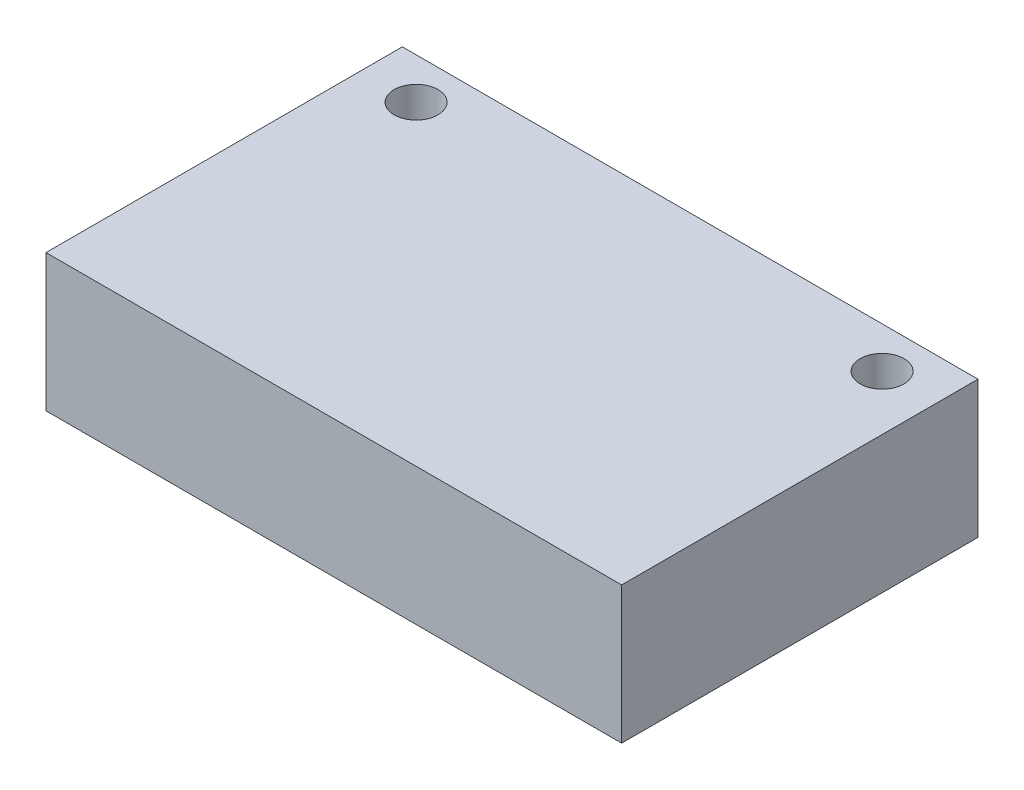
ISO-10303-21;
HEADER;
FILE_DESCRIPTION(('STEP AP214'),'2;1');
FILE_NAME('part.step','',(''),(''),'','','');
FILE_SCHEMA(('AUTOMOTIVE_DESIGN { 1 0 10303 214 1 1 1 1 }'));
ENDSEC;
DATA;
#1=APPLICATION_CONTEXT('core data for automotive mechanical design processes');
#2=APPLICATION_PROTOCOL_DEFINITION('international standard','automotive_design',2000,#1);
#3=PRODUCT_CONTEXT('',#1,'mechanical');
#4=PRODUCT('Part','Part','',(#3));
#5=PRODUCT_RELATED_PRODUCT_CATEGORY('part','',(#4));
#6=PRODUCT_DEFINITION_FORMATION('','',#4);
#7=PRODUCT_DEFINITION_CONTEXT('part definition',#1,'design');
#8=PRODUCT_DEFINITION('design','',#6,#7);
#9=PRODUCT_DEFINITION_SHAPE('','',#8);
#10=(LENGTH_UNIT() NAMED_UNIT(*) SI_UNIT(.MILLI.,.METRE.));
#11=(NAMED_UNIT(*) PLANE_ANGLE_UNIT() SI_UNIT($,.RADIAN.));
#12=(NAMED_UNIT(*) SI_UNIT($,.STERADIAN.) SOLID_ANGLE_UNIT());
#13=UNCERTAINTY_MEASURE_WITH_UNIT(LENGTH_MEASURE(1.E-05),#10,'distance_accuracy_value','');
#14=(GEOMETRIC_REPRESENTATION_CONTEXT(3) GLOBAL_UNCERTAINTY_ASSIGNED_CONTEXT((#13)) GLOBAL_UNIT_ASSIGNED_CONTEXT((#10,
#11,#12)) REPRESENTATION_CONTEXT('',''));
#15=CARTESIAN_POINT('',(0.,0.,0.));
#16=DIRECTION('',(0.,0.,1.));
#17=DIRECTION('',(1.,0.,0.));
#18=AXIS2_PLACEMENT_3D('',#15,#16,#17);
#19=CARTESIAN_POINT('',(0.,10.,0.));
#20=DIRECTION('',(0.,1.,0.));
#21=DIRECTION('',(0.,0.,1.));
#22=AXIS2_PLACEMENT_3D('',#19,#20,#21);
#23=PLANE('',#22);
#24=CARTESIAN_POINT('',(-17.,10.,-10.));
#25=DIRECTION('',(0.,1.,0.));
#26=DIRECTION('',(0.,0.,1.));
#27=AXIS2_PLACEMENT_3D('',#24,#25,#26);
#28=CIRCLE('',#27,1.6);
#29=CARTESIAN_POINT('',(-17.,10.,-8.4));
#30=VERTEX_POINT('',#29);
#31=EDGE_CURVE('E112',#30,#30,#28,.T.);
#32=ORIENTED_EDGE('',*,*,#31,.F.);
#33=EDGE_LOOP('',(#32));
#34=FACE_BOUND('',#33,.T.);
#35=DIRECTION('',(0.,0.,-1.));
#36=VECTOR('',#35,1.);
#37=CARTESIAN_POINT('',(21.,10.,-13.));
#38=LINE('',#37,#36);
#39=CARTESIAN_POINT('',(21.,10.,13.));
#40=VERTEX_POINT('',#39);
#41=CARTESIAN_POINT('',(21.,10.,-13.));
#42=VERTEX_POINT('',#41);
#43=EDGE_CURVE('E92',#40,#42,#38,.T.);
#44=ORIENTED_EDGE('',*,*,#43,.T.);
#45=DIRECTION('',(-1.,0.,0.));
#46=VECTOR('',#45,1.);
#47=CARTESIAN_POINT('',(-21.,10.,-13.));
#48=LINE('',#47,#46);
#49=CARTESIAN_POINT('',(-21.,10.,-13.));
#50=VERTEX_POINT('',#49);
#51=EDGE_CURVE('E87',#42,#50,#48,.T.);
#52=ORIENTED_EDGE('',*,*,#51,.T.);
#53=DIRECTION('',(0.,0.,1.));
#54=VECTOR('',#53,1.);
#55=CARTESIAN_POINT('',(-21.,10.,-13.));
#56=LINE('',#55,#54);
#57=CARTESIAN_POINT('',(-21.,10.,13.));
#58=VERTEX_POINT('',#57);
#59=EDGE_CURVE('E90',#50,#58,#56,.T.);
#60=ORIENTED_EDGE('',*,*,#59,.T.);
#61=DIRECTION('',(1.,0.,0.));
#62=VECTOR('',#61,1.);
#63=CARTESIAN_POINT('',(-21.,10.,13.));
#64=LINE('',#63,#62);
#65=EDGE_CURVE('E57',#58,#40,#64,.T.);
#66=ORIENTED_EDGE('',*,*,#65,.T.);
#67=EDGE_LOOP('',(#44,#52,#60,#66));
#68=FACE_BOUND('',#67,.T.);
#69=CARTESIAN_POINT('',(17.,10.,-10.));
#70=DIRECTION('',(0.,1.,0.));
#71=DIRECTION('',(0.,0.,1.));
#72=AXIS2_PLACEMENT_3D('',#69,#70,#71);
#73=CIRCLE('',#72,1.6);
#74=CARTESIAN_POINT('',(17.,10.,-8.4));
#75=VERTEX_POINT('',#74);
#76=EDGE_CURVE('E134',#75,#75,#73,.T.);
#77=ORIENTED_EDGE('',*,*,#76,.F.);
#78=EDGE_LOOP('',(#77));
#79=FACE_BOUND('',#78,.T.);
#80=ADVANCED_FACE('F39',(#34,#68,#79),#23,.T.);
#81=CARTESIAN_POINT('',(0.,0.,0.));
#82=DIRECTION('',(0.,1.,0.));
#83=DIRECTION('',(0.,0.,1.));
#84=AXIS2_PLACEMENT_3D('',#81,#82,#83);
#85=PLANE('',#84);
#86=DIRECTION('',(0.,0.,-1.));
#87=VECTOR('',#86,1.);
#88=CARTESIAN_POINT('',(21.,0.,-13.));
#89=LINE('',#88,#87);
#90=CARTESIAN_POINT('',(21.,0.,13.));
#91=VERTEX_POINT('',#90);
#92=CARTESIAN_POINT('',(21.,0.,-13.));
#93=VERTEX_POINT('',#92);
#94=EDGE_CURVE('E108',#91,#93,#89,.T.);
#95=ORIENTED_EDGE('',*,*,#94,.F.);
#96=DIRECTION('',(1.,0.,0.));
#97=VECTOR('',#96,1.);
#98=CARTESIAN_POINT('',(-21.,0.,13.));
#99=LINE('',#98,#97);
#100=CARTESIAN_POINT('',(-21.,0.,13.));
#101=VERTEX_POINT('',#100);
#102=EDGE_CURVE('E80',#101,#91,#99,.T.);
#103=ORIENTED_EDGE('',*,*,#102,.F.);
#104=DIRECTION('',(0.,0.,1.));
#105=VECTOR('',#104,1.);
#106=CARTESIAN_POINT('',(-21.,0.,-13.));
#107=LINE('',#106,#105);
#108=CARTESIAN_POINT('',(-21.,0.,-13.));
#109=VERTEX_POINT('',#108);
#110=EDGE_CURVE('E74',#109,#101,#107,.T.);
#111=ORIENTED_EDGE('',*,*,#110,.F.);
#112=DIRECTION('',(-1.,0.,0.));
#113=VECTOR('',#112,1.);
#114=CARTESIAN_POINT('',(-21.,0.,-13.));
#115=LINE('',#114,#113);
#116=EDGE_CURVE('E97',#93,#109,#115,.T.);
#117=ORIENTED_EDGE('',*,*,#116,.F.);
#118=EDGE_LOOP('',(#95,#103,#111,#117));
#119=FACE_BOUND('',#118,.T.);
#120=CARTESIAN_POINT('',(-17.,0.,-10.));
#121=DIRECTION('',(0.,1.,0.));
#122=DIRECTION('',(0.,0.,1.));
#123=AXIS2_PLACEMENT_3D('',#120,#121,#122);
#124=CIRCLE('',#123,1.6);
#125=CARTESIAN_POINT('',(-17.,0.,-8.4));
#126=VERTEX_POINT('',#125);
#127=EDGE_CURVE('E130',#126,#126,#124,.T.);
#128=ORIENTED_EDGE('',*,*,#127,.T.);
#129=EDGE_LOOP('',(#128));
#130=FACE_BOUND('',#129,.T.);
#131=CARTESIAN_POINT('',(17.,0.,-10.));
#132=DIRECTION('',(0.,1.,0.));
#133=DIRECTION('',(0.,0.,1.));
#134=AXIS2_PLACEMENT_3D('',#131,#132,#133);
#135=CIRCLE('',#134,1.6);
#136=CARTESIAN_POINT('',(17.,0.,-8.4));
#137=VERTEX_POINT('',#136);
#138=EDGE_CURVE('E138',#137,#137,#135,.T.);
#139=ORIENTED_EDGE('',*,*,#138,.T.);
#140=EDGE_LOOP('',(#139));
#141=FACE_BOUND('',#140,.T.);
#142=ADVANCED_FACE('F125',(#119,#130,#141),#85,.F.);
#143=CARTESIAN_POINT('',(21.,10.,-13.));
#144=DIRECTION('',(-1.,0.,0.));
#145=DIRECTION('',(0.,0.,1.));
#146=AXIS2_PLACEMENT_3D('',#143,#144,#145);
#147=PLANE('',#146);
#148=ORIENTED_EDGE('',*,*,#94,.T.);
#149=DIRECTION('',(0.,-1.,0.));
#150=VECTOR('',#149,1.);
#151=CARTESIAN_POINT('',(21.,10.,-13.));
#152=LINE('',#151,#150);
#153=EDGE_CURVE('E11',#42,#93,#152,.T.);
#154=ORIENTED_EDGE('',*,*,#153,.F.);
#155=ORIENTED_EDGE('',*,*,#43,.F.);
#156=DIRECTION('',(0.,-1.,0.));
#157=VECTOR('',#156,1.);
#158=CARTESIAN_POINT('',(21.,10.,13.));
#159=LINE('',#158,#157);
#160=EDGE_CURVE('E104',#40,#91,#159,.T.);
#161=ORIENTED_EDGE('',*,*,#160,.T.);
#162=EDGE_LOOP('',(#148,#154,#155,#161));
#163=FACE_BOUND('',#162,.T.);
#164=ADVANCED_FACE('F41',(#163),#147,.F.);
#165=CARTESIAN_POINT('',(-21.,10.,-13.));
#166=DIRECTION('',(0.,0.,1.));
#167=DIRECTION('',(1.,0.,0.));
#168=AXIS2_PLACEMENT_3D('',#165,#166,#167);
#169=PLANE('',#168);
#170=ORIENTED_EDGE('',*,*,#116,.T.);
#171=DIRECTION('',(0.,-1.,0.));
#172=VECTOR('',#171,1.);
#173=CARTESIAN_POINT('',(-21.,10.,-13.));
#174=LINE('',#173,#172);
#175=EDGE_CURVE('E49',#50,#109,#174,.T.);
#176=ORIENTED_EDGE('',*,*,#175,.F.);
#177=ORIENTED_EDGE('',*,*,#51,.F.);
#178=ORIENTED_EDGE('',*,*,#153,.T.);
#179=EDGE_LOOP('',(#170,#176,#177,#178));
#180=FACE_BOUND('',#179,.T.);
#181=ADVANCED_FACE('F96',(#180),#169,.F.);
#182=CARTESIAN_POINT('',(-21.,10.,-13.));
#183=DIRECTION('',(1.,0.,0.));
#184=DIRECTION('',(0.,0.,-1.));
#185=AXIS2_PLACEMENT_3D('',#182,#183,#184);
#186=PLANE('',#185);
#187=ORIENTED_EDGE('',*,*,#110,.T.);
#188=DIRECTION('',(0.,-1.,0.));
#189=VECTOR('',#188,1.);
#190=CARTESIAN_POINT('',(-21.,10.,13.));
#191=LINE('',#190,#189);
#192=EDGE_CURVE('E99',#58,#101,#191,.T.);
#193=ORIENTED_EDGE('',*,*,#192,.F.);
#194=ORIENTED_EDGE('',*,*,#59,.F.);
#195=ORIENTED_EDGE('',*,*,#175,.T.);
#196=EDGE_LOOP('',(#187,#193,#194,#195));
#197=FACE_BOUND('',#196,.T.);
#198=ADVANCED_FACE('F100',(#197),#186,.F.);
#199=CARTESIAN_POINT('',(-21.,10.,13.));
#200=DIRECTION('',(0.,0.,-1.));
#201=DIRECTION('',(-1.,0.,0.));
#202=AXIS2_PLACEMENT_3D('',#199,#200,#201);
#203=PLANE('',#202);
#204=ORIENTED_EDGE('',*,*,#102,.T.);
#205=ORIENTED_EDGE('',*,*,#160,.F.);
#206=ORIENTED_EDGE('',*,*,#65,.F.);
#207=ORIENTED_EDGE('',*,*,#192,.T.);
#208=EDGE_LOOP('',(#204,#205,#206,#207));
#209=FACE_BOUND('',#208,.T.);
#210=ADVANCED_FACE('F122',(#209),#203,.F.);
#211=CARTESIAN_POINT('',(-17.,10.,-10.));
#212=DIRECTION('',(0.,-1.,0.));
#213=DIRECTION('',(0.,0.,-1.));
#214=AXIS2_PLACEMENT_3D('',#211,#212,#213);
#215=CYLINDRICAL_SURFACE('',#214,1.6);
#216=ORIENTED_EDGE('',*,*,#31,.T.);
#217=EDGE_LOOP('',(#216));
#218=FACE_BOUND('',#217,.T.);
#219=ORIENTED_EDGE('',*,*,#127,.F.);
#220=EDGE_LOOP('',(#219));
#221=FACE_BOUND('',#220,.T.);
#222=ADVANCED_FACE('F157',(#218,#221),#215,.F.);
#223=CARTESIAN_POINT('',(17.,10.,-10.));
#224=DIRECTION('',(0.,-1.,0.));
#225=DIRECTION('',(0.,0.,-1.));
#226=AXIS2_PLACEMENT_3D('',#223,#224,#225);
#227=CYLINDRICAL_SURFACE('',#226,1.6);
#228=ORIENTED_EDGE('',*,*,#76,.T.);
#229=EDGE_LOOP('',(#228));
#230=FACE_BOUND('',#229,.T.);
#231=ORIENTED_EDGE('',*,*,#138,.F.);
#232=EDGE_LOOP('',(#231));
#233=FACE_BOUND('',#232,.T.);
#234=ADVANCED_FACE('F146',(#230,#233),#227,.F.);
#235=CLOSED_SHELL('',(#80,#142,#164,#181,#198,#210,#222,#234));
#236=MANIFOLD_SOLID_BREP('B2',#235);
#237=ADVANCED_BREP_SHAPE_REPRESENTATION('',(#18,#236),#14);
#238=SHAPE_DEFINITION_REPRESENTATION(#9,#237);
ENDSEC;
END-ISO-10303-21;
